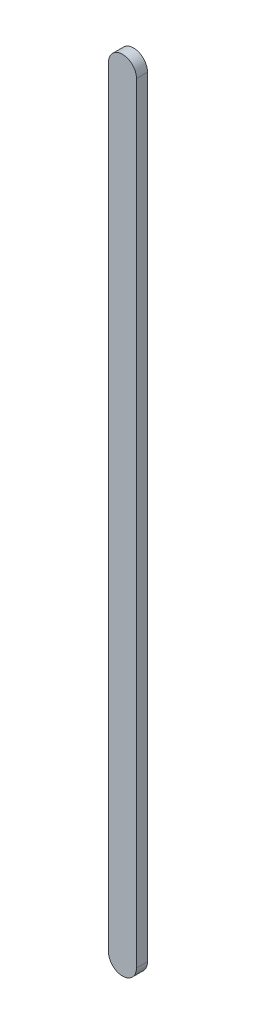
ISO-10303-21;
HEADER;
FILE_DESCRIPTION(('STEP AP214'),'2;1');
FILE_NAME('part.step','',(''),(''),'','','');
FILE_SCHEMA(('AUTOMOTIVE_DESIGN { 1 0 10303 214 1 1 1 1 }'));
ENDSEC;
DATA;
#1=APPLICATION_CONTEXT('core data for automotive mechanical design processes');
#2=APPLICATION_PROTOCOL_DEFINITION('international standard','automotive_design',2000,#1);
#3=PRODUCT_CONTEXT('',#1,'mechanical');
#4=PRODUCT('Part','Part','',(#3));
#5=PRODUCT_RELATED_PRODUCT_CATEGORY('part','',(#4));
#6=PRODUCT_DEFINITION_FORMATION('','',#4);
#7=PRODUCT_DEFINITION_CONTEXT('part definition',#1,'design');
#8=PRODUCT_DEFINITION('design','',#6,#7);
#9=PRODUCT_DEFINITION_SHAPE('','',#8);
#10=(LENGTH_UNIT() NAMED_UNIT(*) SI_UNIT(.MILLI.,.METRE.));
#11=(NAMED_UNIT(*) PLANE_ANGLE_UNIT() SI_UNIT($,.RADIAN.));
#12=(NAMED_UNIT(*) SI_UNIT($,.STERADIAN.) SOLID_ANGLE_UNIT());
#13=UNCERTAINTY_MEASURE_WITH_UNIT(LENGTH_MEASURE(1.E-05),#10,'distance_accuracy_value','');
#14=(GEOMETRIC_REPRESENTATION_CONTEXT(3) GLOBAL_UNCERTAINTY_ASSIGNED_CONTEXT((#13)) GLOBAL_UNIT_ASSIGNED_CONTEXT((#10,
#11,#12)) REPRESENTATION_CONTEXT('',''));
#15=CARTESIAN_POINT('',(0.,0.,0.));
#16=DIRECTION('',(0.,0.,1.));
#17=DIRECTION('',(1.,0.,0.));
#18=AXIS2_PLACEMENT_3D('',#15,#16,#17);
#19=CARTESIAN_POINT('',(122.5296,100.3481356,0.));
#20=DIRECTION('',(-1.,0.,0.));
#21=DIRECTION('',(0.,1.,0.));
#22=AXIS2_PLACEMENT_3D('',#19,#20,#21);
#23=PLANE('',#22);
#24=DIRECTION('',(0.,1.,0.));
#25=VECTOR('',#24,1.);
#26=CARTESIAN_POINT('',(122.5296,100.3481356,0.1999996));
#27=LINE('',#26,#25);
#28=CARTESIAN_POINT('',(122.5296,100.3481356,0.1999996));
#29=VERTEX_POINT('',#28);
#30=CARTESIAN_POINT('',(122.5296,114.3254,0.1999996));
#31=VERTEX_POINT('',#30);
#32=EDGE_CURVE('E11',#29,#31,#27,.T.);
#33=ORIENTED_EDGE('',*,*,#32,.F.);
#34=DIRECTION('',(0.,0.,1.));
#35=VECTOR('',#34,1.);
#36=CARTESIAN_POINT('',(122.5296,100.3481356,0.));
#37=LINE('',#36,#35);
#38=CARTESIAN_POINT('',(122.5296,100.3481356,0.));
#39=VERTEX_POINT('',#38);
#40=EDGE_CURVE('E24',#39,#29,#37,.T.);
#41=ORIENTED_EDGE('',*,*,#40,.F.);
#42=DIRECTION('',(0.,1.,0.));
#43=VECTOR('',#42,1.);
#44=CARTESIAN_POINT('',(122.5296,100.3481356,0.));
#45=LINE('',#44,#43);
#46=CARTESIAN_POINT('',(122.5296,114.3254,0.));
#47=VERTEX_POINT('',#46);
#48=EDGE_CURVE('E75',#39,#47,#45,.T.);
#49=ORIENTED_EDGE('',*,*,#48,.T.);
#50=DIRECTION('',(0.,0.,1.));
#51=VECTOR('',#50,1.);
#52=CARTESIAN_POINT('',(122.5296,114.3254,0.));
#53=LINE('',#52,#51);
#54=EDGE_CURVE('E37',#47,#31,#53,.T.);
#55=ORIENTED_EDGE('',*,*,#54,.T.);
#56=EDGE_LOOP('',(#33,#41,#49,#55));
#57=FACE_BOUND('',#56,.T.);
#58=ADVANCED_FACE('F17',(#57),#23,.F.);
#59=CARTESIAN_POINT('',(122.2756,114.3254,0.));
#60=DIRECTION('',(0.,0.,-1.));
#61=DIRECTION('',(1.,0.,0.));
#62=AXIS2_PLACEMENT_3D('',#59,#60,#61);
#63=CYLINDRICAL_SURFACE('',#62,0.253999999999995);
#64=CARTESIAN_POINT('',(122.2756,114.3254,0.1999996));
#65=DIRECTION('',(0.,0.,1.));
#66=DIRECTION('',(1.,0.,0.));
#67=AXIS2_PLACEMENT_3D('',#64,#65,#66);
#68=CIRCLE('',#67,0.253999999999995);
#69=CARTESIAN_POINT('',(122.0216,114.3254,0.1999996));
#70=VERTEX_POINT('',#69);
#71=EDGE_CURVE('E83',#31,#70,#68,.T.);
#72=ORIENTED_EDGE('',*,*,#71,.F.);
#73=ORIENTED_EDGE('',*,*,#54,.F.);
#74=CARTESIAN_POINT('',(122.2756,114.3254,0.));
#75=DIRECTION('',(0.,0.,1.));
#76=DIRECTION('',(1.,0.,0.));
#77=AXIS2_PLACEMENT_3D('',#74,#75,#76);
#78=CIRCLE('',#77,0.253999999999995);
#79=CARTESIAN_POINT('',(122.0216,114.3254,0.));
#80=VERTEX_POINT('',#79);
#81=EDGE_CURVE('E81',#47,#80,#78,.T.);
#82=ORIENTED_EDGE('',*,*,#81,.T.);
#83=DIRECTION('',(0.,0.,1.));
#84=VECTOR('',#83,1.);
#85=CARTESIAN_POINT('',(122.0216,114.3254,0.));
#86=LINE('',#85,#84);
#87=EDGE_CURVE('E67',#80,#70,#86,.T.);
#88=ORIENTED_EDGE('',*,*,#87,.T.);
#89=EDGE_LOOP('',(#72,#73,#82,#88));
#90=FACE_BOUND('',#89,.T.);
#91=ADVANCED_FACE('F89',(#90),#63,.T.);
#92=CARTESIAN_POINT('',(122.0216,114.3254,0.));
#93=DIRECTION('',(1.,0.,0.));
#94=DIRECTION('',(0.,-1.,0.));
#95=AXIS2_PLACEMENT_3D('',#92,#93,#94);
#96=PLANE('',#95);
#97=DIRECTION('',(0.,-1.,0.));
#98=VECTOR('',#97,1.);
#99=CARTESIAN_POINT('',(122.0216,114.3254,0.1999996));
#100=LINE('',#99,#98);
#101=CARTESIAN_POINT('',(122.0216,100.3481356,0.1999996));
#102=VERTEX_POINT('',#101);
#103=EDGE_CURVE('E71',#70,#102,#100,.T.);
#104=ORIENTED_EDGE('',*,*,#103,.F.);
#105=ORIENTED_EDGE('',*,*,#87,.F.);
#106=DIRECTION('',(0.,-1.,0.));
#107=VECTOR('',#106,1.);
#108=CARTESIAN_POINT('',(122.0216,114.3254,0.));
#109=LINE('',#108,#107);
#110=CARTESIAN_POINT('',(122.0216,100.3481356,0.));
#111=VERTEX_POINT('',#110);
#112=EDGE_CURVE('E63',#80,#111,#109,.T.);
#113=ORIENTED_EDGE('',*,*,#112,.T.);
#114=DIRECTION('',(0.,0.,1.));
#115=VECTOR('',#114,1.);
#116=CARTESIAN_POINT('',(122.0216,100.3481356,0.));
#117=LINE('',#116,#115);
#118=EDGE_CURVE('E53',#111,#102,#117,.T.);
#119=ORIENTED_EDGE('',*,*,#118,.T.);
#120=EDGE_LOOP('',(#104,#105,#113,#119));
#121=FACE_BOUND('',#120,.T.);
#122=ADVANCED_FACE('F66',(#121),#96,.F.);
#123=CARTESIAN_POINT('',(122.2756,100.3481356,0.));
#124=DIRECTION('',(0.,0.,-1.));
#125=DIRECTION('',(-1.,0.,0.));
#126=AXIS2_PLACEMENT_3D('',#123,#124,#125);
#127=CYLINDRICAL_SURFACE('',#126,0.254);
#128=CARTESIAN_POINT('',(122.2756,100.3481356,0.1999996));
#129=DIRECTION('',(0.,0.,1.));
#130=DIRECTION('',(-1.,0.,0.));
#131=AXIS2_PLACEMENT_3D('',#128,#129,#130);
#132=CIRCLE('',#131,0.254);
#133=EDGE_CURVE('E59',#102,#29,#132,.T.);
#134=ORIENTED_EDGE('',*,*,#133,.F.);
#135=ORIENTED_EDGE('',*,*,#118,.F.);
#136=CARTESIAN_POINT('',(122.2756,100.3481356,0.));
#137=DIRECTION('',(0.,0.,1.));
#138=DIRECTION('',(-1.,0.,0.));
#139=AXIS2_PLACEMENT_3D('',#136,#137,#138);
#140=CIRCLE('',#139,0.254);
#141=EDGE_CURVE('E57',#111,#39,#140,.T.);
#142=ORIENTED_EDGE('',*,*,#141,.T.);
#143=ORIENTED_EDGE('',*,*,#40,.T.);
#144=EDGE_LOOP('',(#134,#135,#142,#143));
#145=FACE_BOUND('',#144,.T.);
#146=ADVANCED_FACE('F55',(#145),#127,.T.);
#147=CARTESIAN_POINT('',(122.5296,100.3481356,0.));
#148=DIRECTION('',(0.,0.,-1.));
#149=DIRECTION('',(-1.,0.,0.));
#150=AXIS2_PLACEMENT_3D('',#147,#148,#149);
#151=PLANE('',#150);
#152=ORIENTED_EDGE('',*,*,#141,.F.);
#153=ORIENTED_EDGE('',*,*,#112,.F.);
#154=ORIENTED_EDGE('',*,*,#81,.F.);
#155=ORIENTED_EDGE('',*,*,#48,.F.);
#156=EDGE_LOOP('',(#152,#153,#154,#155));
#157=FACE_BOUND('',#156,.T.);
#158=ADVANCED_FACE('F74',(#157),#151,.T.);
#159=CARTESIAN_POINT('',(122.5296,100.3481356,0.1999996));
#160=DIRECTION('',(0.,0.,-1.));
#161=DIRECTION('',(-1.,0.,0.));
#162=AXIS2_PLACEMENT_3D('',#159,#160,#161);
#163=PLANE('',#162);
#164=ORIENTED_EDGE('',*,*,#32,.T.);
#165=ORIENTED_EDGE('',*,*,#71,.T.);
#166=ORIENTED_EDGE('',*,*,#103,.T.);
#167=ORIENTED_EDGE('',*,*,#133,.T.);
#168=EDGE_LOOP('',(#164,#165,#166,#167));
#169=FACE_BOUND('',#168,.T.);
#170=ADVANCED_FACE('F91',(#169),#163,.F.);
#171=CLOSED_SHELL('',(#58,#91,#122,#146,#158,#170));
#172=MANIFOLD_SOLID_BREP('B1',#171);
#173=ADVANCED_BREP_SHAPE_REPRESENTATION('',(#18,#172),#14);
#174=SHAPE_DEFINITION_REPRESENTATION(#9,#173);
ENDSEC;
END-ISO-10303-21;
